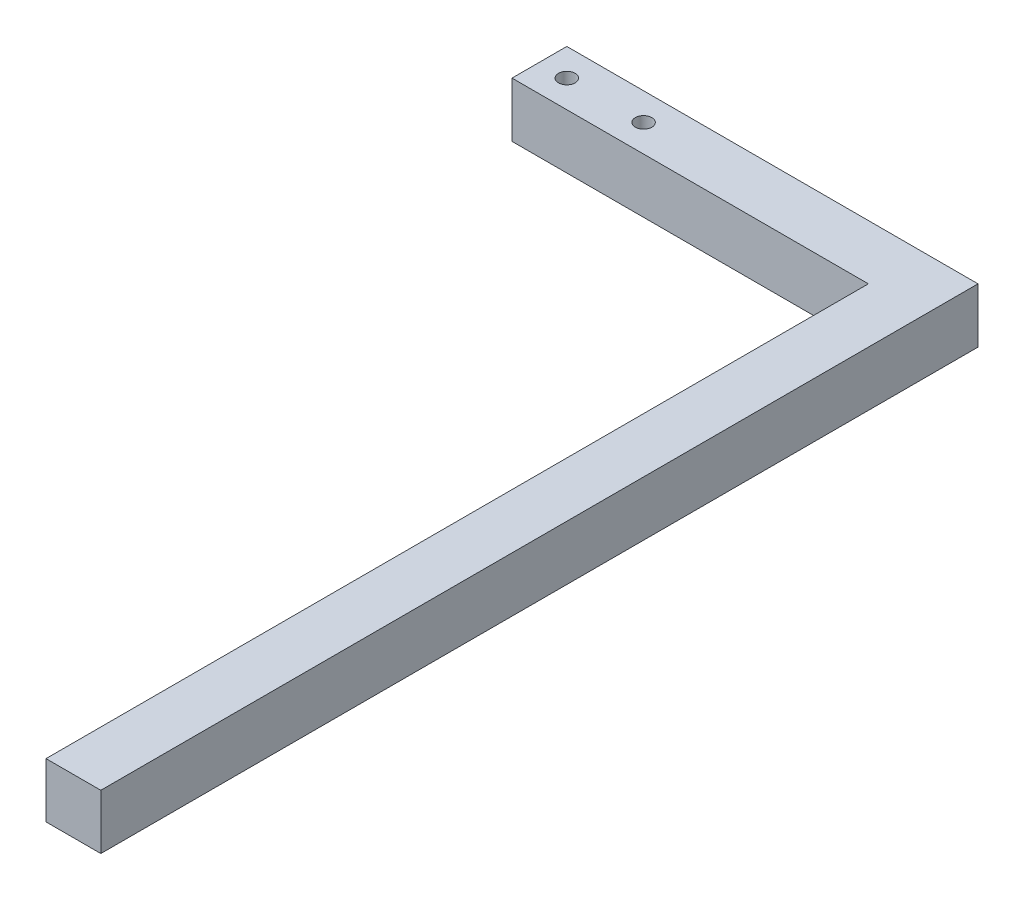
ISO-10303-21;
HEADER;
FILE_DESCRIPTION(('STEP AP214'),'2;1');
FILE_NAME('part.step','',(''),(''),'','','');
FILE_SCHEMA(('AUTOMOTIVE_DESIGN { 1 0 10303 214 1 1 1 1 }'));
ENDSEC;
DATA;
#1=APPLICATION_CONTEXT('core data for automotive mechanical design processes');
#2=APPLICATION_PROTOCOL_DEFINITION('international standard','automotive_design',2000,#1);
#3=PRODUCT_CONTEXT('',#1,'mechanical');
#4=PRODUCT('Part','Part','',(#3));
#5=PRODUCT_RELATED_PRODUCT_CATEGORY('part','',(#4));
#6=PRODUCT_DEFINITION_FORMATION('','',#4);
#7=PRODUCT_DEFINITION_CONTEXT('part definition',#1,'design');
#8=PRODUCT_DEFINITION('design','',#6,#7);
#9=PRODUCT_DEFINITION_SHAPE('','',#8);
#10=(LENGTH_UNIT() NAMED_UNIT(*) SI_UNIT(.MILLI.,.METRE.));
#11=(NAMED_UNIT(*) PLANE_ANGLE_UNIT() SI_UNIT($,.RADIAN.));
#12=(NAMED_UNIT(*) SI_UNIT($,.STERADIAN.) SOLID_ANGLE_UNIT());
#13=UNCERTAINTY_MEASURE_WITH_UNIT(LENGTH_MEASURE(1.E-05),#10,'distance_accuracy_value','');
#14=(GEOMETRIC_REPRESENTATION_CONTEXT(3) GLOBAL_UNCERTAINTY_ASSIGNED_CONTEXT((#13)) GLOBAL_UNIT_ASSIGNED_CONTEXT((#10,
#11,#12)) REPRESENTATION_CONTEXT('',''));
#15=CARTESIAN_POINT('',(0.,0.,0.));
#16=DIRECTION('',(0.,0.,1.));
#17=DIRECTION('',(1.,0.,0.));
#18=AXIS2_PLACEMENT_3D('',#15,#16,#17);
#19=CARTESIAN_POINT('',(0.,10.,0.));
#20=DIRECTION('',(0.,0.,-1.));
#21=DIRECTION('',(-1.,0.,0.));
#22=AXIS2_PLACEMENT_3D('',#19,#20,#21);
#23=PLANE('',#22);
#24=DIRECTION('',(0.,-1.,0.));
#25=VECTOR('',#24,1.);
#26=CARTESIAN_POINT('',(65.,0.,0.));
#27=LINE('',#26,#25);
#28=CARTESIAN_POINT('',(65.,10.,0.));
#29=VERTEX_POINT('',#28);
#30=CARTESIAN_POINT('',(65.,0.,0.));
#31=VERTEX_POINT('',#30);
#32=EDGE_CURVE('E51',#29,#31,#27,.T.);
#33=ORIENTED_EDGE('',*,*,#32,.F.);
#34=DIRECTION('',(1.,0.,0.));
#35=VECTOR('',#34,1.);
#36=CARTESIAN_POINT('',(0.,10.,0.));
#37=LINE('',#36,#35);
#38=CARTESIAN_POINT('',(0.,10.,0.));
#39=VERTEX_POINT('',#38);
#40=EDGE_CURVE('E79',#39,#29,#37,.T.);
#41=ORIENTED_EDGE('',*,*,#40,.F.);
#42=DIRECTION('',(0.,-1.,0.));
#43=VECTOR('',#42,1.);
#44=CARTESIAN_POINT('',(0.,10.,0.));
#45=LINE('',#44,#43);
#46=CARTESIAN_POINT('',(0.,0.,0.));
#47=VERTEX_POINT('',#46);
#48=EDGE_CURVE('E11',#39,#47,#45,.T.);
#49=ORIENTED_EDGE('',*,*,#48,.T.);
#50=DIRECTION('',(1.,0.,0.));
#51=VECTOR('',#50,1.);
#52=CARTESIAN_POINT('',(0.,0.,0.));
#53=LINE('',#52,#51);
#54=EDGE_CURVE('E145',#47,#31,#53,.T.);
#55=ORIENTED_EDGE('',*,*,#54,.T.);
#56=EDGE_LOOP('',(#33,#41,#49,#55));
#57=FACE_BOUND('',#56,.T.);
#58=ADVANCED_FACE('F36',(#57),#23,.F.);
#59=CARTESIAN_POINT('',(0.,10.,0.));
#60=DIRECTION('',(0.,-1.,0.));
#61=DIRECTION('',(0.,0.,-1.));
#62=AXIS2_PLACEMENT_3D('',#59,#60,#61);
#63=PLANE('',#62);
#64=DIRECTION('',(0.,0.,1.));
#65=VECTOR('',#64,1.);
#66=CARTESIAN_POINT('',(0.,10.,0.));
#67=LINE('',#66,#65);
#68=CARTESIAN_POINT('',(0.,10.,-10.));
#69=VERTEX_POINT('',#68);
#70=EDGE_CURVE('E138',#69,#39,#67,.T.);
#71=ORIENTED_EDGE('',*,*,#70,.T.);
#72=ORIENTED_EDGE('',*,*,#40,.T.);
#73=DIRECTION('',(0.,0.,-1.));
#74=VECTOR('',#73,1.);
#75=CARTESIAN_POINT('',(65.,10.,150.));
#76=LINE('',#75,#74);
#77=CARTESIAN_POINT('',(65.,10.,150.));
#78=VERTEX_POINT('',#77);
#79=EDGE_CURVE('E107',#78,#29,#76,.T.);
#80=ORIENTED_EDGE('',*,*,#79,.F.);
#81=DIRECTION('',(-1.,0.,0.));
#82=VECTOR('',#81,1.);
#83=CARTESIAN_POINT('',(75.,10.,150.));
#84=LINE('',#83,#82);
#85=CARTESIAN_POINT('',(75.,10.,150.));
#86=VERTEX_POINT('',#85);
#87=EDGE_CURVE('E103',#86,#78,#84,.T.);
#88=ORIENTED_EDGE('',*,*,#87,.F.);
#89=DIRECTION('',(0.,0.,-1.));
#90=VECTOR('',#89,1.);
#91=CARTESIAN_POINT('',(75.,10.,-10.));
#92=LINE('',#91,#90);
#93=CARTESIAN_POINT('',(75.,10.,-10.));
#94=VERTEX_POINT('',#93);
#95=EDGE_CURVE('E96',#86,#94,#92,.T.);
#96=ORIENTED_EDGE('',*,*,#95,.T.);
#97=DIRECTION('',(-1.,0.,0.));
#98=VECTOR('',#97,1.);
#99=CARTESIAN_POINT('',(0.,10.,-10.));
#100=LINE('',#99,#98);
#101=EDGE_CURVE('E60',#94,#69,#100,.T.);
#102=ORIENTED_EDGE('',*,*,#101,.T.);
#103=EDGE_LOOP('',(#71,#72,#80,#88,#96,#102));
#104=FACE_BOUND('',#103,.T.);
#105=CARTESIAN_POINT('',(5.,10.,-5.));
#106=DIRECTION('',(0.,1.,0.));
#107=DIRECTION('',(0.,0.,1.));
#108=AXIS2_PLACEMENT_3D('',#105,#106,#107);
#109=CIRCLE('',#108,1.51832050823192);
#110=CARTESIAN_POINT('',(5.,10.,-3.48167949176808));
#111=VERTEX_POINT('',#110);
#112=EDGE_CURVE('E132',#111,#111,#109,.T.);
#113=ORIENTED_EDGE('',*,*,#112,.F.);
#114=EDGE_LOOP('',(#113));
#115=FACE_BOUND('',#114,.T.);
#116=CARTESIAN_POINT('',(19.,10.,-5.));
#117=DIRECTION('',(0.,1.,0.));
#118=DIRECTION('',(0.,0.,1.));
#119=AXIS2_PLACEMENT_3D('',#116,#117,#118);
#120=CIRCLE('',#119,1.51832050823193);
#121=CARTESIAN_POINT('',(19.,10.,-3.48167949176807));
#122=VERTEX_POINT('',#121);
#123=EDGE_CURVE('E126',#122,#122,#120,.T.);
#124=ORIENTED_EDGE('',*,*,#123,.F.);
#125=EDGE_LOOP('',(#124));
#126=FACE_BOUND('',#125,.T.);
#127=ADVANCED_FACE('F104',(#104,#115,#126),#63,.F.);
#128=CARTESIAN_POINT('',(0.,0.,0.));
#129=DIRECTION('',(0.,-1.,0.));
#130=DIRECTION('',(0.,0.,-1.));
#131=AXIS2_PLACEMENT_3D('',#128,#129,#130);
#132=PLANE('',#131);
#133=CARTESIAN_POINT('',(5.,0.,-5.));
#134=DIRECTION('',(0.,1.,0.));
#135=DIRECTION('',(0.,0.,1.));
#136=AXIS2_PLACEMENT_3D('',#133,#134,#135);
#137=CIRCLE('',#136,1.51832050823192);
#138=CARTESIAN_POINT('',(5.,0.,-3.48167949176808));
#139=VERTEX_POINT('',#138);
#140=EDGE_CURVE('E129',#139,#139,#137,.T.);
#141=ORIENTED_EDGE('',*,*,#140,.T.);
#142=EDGE_LOOP('',(#141));
#143=FACE_BOUND('',#142,.T.);
#144=DIRECTION('',(0.,0.,1.));
#145=VECTOR('',#144,1.);
#146=CARTESIAN_POINT('',(0.,0.,0.));
#147=LINE('',#146,#145);
#148=CARTESIAN_POINT('',(0.,0.,-10.));
#149=VERTEX_POINT('',#148);
#150=EDGE_CURVE('E135',#149,#47,#147,.T.);
#151=ORIENTED_EDGE('',*,*,#150,.F.);
#152=DIRECTION('',(-1.,0.,0.));
#153=VECTOR('',#152,1.);
#154=CARTESIAN_POINT('',(0.,0.,-10.));
#155=LINE('',#154,#153);
#156=CARTESIAN_POINT('',(75.,0.,-10.));
#157=VERTEX_POINT('',#156);
#158=EDGE_CURVE('E77',#157,#149,#155,.T.);
#159=ORIENTED_EDGE('',*,*,#158,.F.);
#160=DIRECTION('',(0.,0.,-1.));
#161=VECTOR('',#160,1.);
#162=CARTESIAN_POINT('',(75.,0.,-10.));
#163=LINE('',#162,#161);
#164=CARTESIAN_POINT('',(75.,0.,150.));
#165=VERTEX_POINT('',#164);
#166=EDGE_CURVE('E147',#165,#157,#163,.T.);
#167=ORIENTED_EDGE('',*,*,#166,.F.);
#168=DIRECTION('',(1.,0.,0.));
#169=VECTOR('',#168,1.);
#170=CARTESIAN_POINT('',(75.,0.,150.));
#171=LINE('',#170,#169);
#172=CARTESIAN_POINT('',(65.,0.,150.));
#173=VERTEX_POINT('',#172);
#174=EDGE_CURVE('E115',#173,#165,#171,.T.);
#175=ORIENTED_EDGE('',*,*,#174,.F.);
#176=DIRECTION('',(0.,0.,-1.));
#177=VECTOR('',#176,1.);
#178=CARTESIAN_POINT('',(65.,0.,150.));
#179=LINE('',#178,#177);
#180=EDGE_CURVE('E120',#173,#31,#179,.T.);
#181=ORIENTED_EDGE('',*,*,#180,.T.);
#182=ORIENTED_EDGE('',*,*,#54,.F.);
#183=EDGE_LOOP('',(#151,#159,#167,#175,#181,#182));
#184=FACE_BOUND('',#183,.T.);
#185=CARTESIAN_POINT('',(19.,0.,-5.));
#186=DIRECTION('',(0.,1.,0.));
#187=DIRECTION('',(0.,0.,1.));
#188=AXIS2_PLACEMENT_3D('',#185,#186,#187);
#189=CIRCLE('',#188,1.51832050823193);
#190=CARTESIAN_POINT('',(19.,0.,-3.48167949176807));
#191=VERTEX_POINT('',#190);
#192=EDGE_CURVE('E125',#191,#191,#189,.T.);
#193=ORIENTED_EDGE('',*,*,#192,.T.);
#194=EDGE_LOOP('',(#193));
#195=FACE_BOUND('',#194,.T.);
#196=ADVANCED_FACE('F153',(#143,#184,#195),#132,.T.);
#197=CARTESIAN_POINT('',(0.,10.,0.));
#198=DIRECTION('',(1.,0.,0.));
#199=DIRECTION('',(0.,0.,-1.));
#200=AXIS2_PLACEMENT_3D('',#197,#198,#199);
#201=PLANE('',#200);
#202=ORIENTED_EDGE('',*,*,#150,.T.);
#203=ORIENTED_EDGE('',*,*,#48,.F.);
#204=ORIENTED_EDGE('',*,*,#70,.F.);
#205=DIRECTION('',(0.,-1.,0.));
#206=VECTOR('',#205,1.);
#207=CARTESIAN_POINT('',(0.,10.,-10.));
#208=LINE('',#207,#206);
#209=EDGE_CURVE('E142',#69,#149,#208,.T.);
#210=ORIENTED_EDGE('',*,*,#209,.T.);
#211=EDGE_LOOP('',(#202,#203,#204,#210));
#212=FACE_BOUND('',#211,.T.);
#213=ADVANCED_FACE('F38',(#212),#201,.F.);
#214=CARTESIAN_POINT('',(75.,10.,-10.));
#215=DIRECTION('',(-1.,0.,0.));
#216=DIRECTION('',(0.,0.,1.));
#217=AXIS2_PLACEMENT_3D('',#214,#215,#216);
#218=PLANE('',#217);
#219=ORIENTED_EDGE('',*,*,#166,.T.);
#220=DIRECTION('',(0.,-1.,0.));
#221=VECTOR('',#220,1.);
#222=CARTESIAN_POINT('',(75.,10.,-10.));
#223=LINE('',#222,#221);
#224=EDGE_CURVE('E44',#94,#157,#223,.T.);
#225=ORIENTED_EDGE('',*,*,#224,.F.);
#226=ORIENTED_EDGE('',*,*,#95,.F.);
#227=DIRECTION('',(0.,1.,0.));
#228=VECTOR('',#227,1.);
#229=CARTESIAN_POINT('',(75.,0.,150.));
#230=LINE('',#229,#228);
#231=EDGE_CURVE('E100',#165,#86,#230,.T.);
#232=ORIENTED_EDGE('',*,*,#231,.F.);
#233=EDGE_LOOP('',(#219,#225,#226,#232));
#234=FACE_BOUND('',#233,.T.);
#235=ADVANCED_FACE('F98',(#234),#218,.F.);
#236=CARTESIAN_POINT('',(0.,10.,-10.));
#237=DIRECTION('',(0.,0.,1.));
#238=DIRECTION('',(1.,0.,0.));
#239=AXIS2_PLACEMENT_3D('',#236,#237,#238);
#240=PLANE('',#239);
#241=ORIENTED_EDGE('',*,*,#158,.T.);
#242=ORIENTED_EDGE('',*,*,#209,.F.);
#243=ORIENTED_EDGE('',*,*,#101,.F.);
#244=ORIENTED_EDGE('',*,*,#224,.T.);
#245=EDGE_LOOP('',(#241,#242,#243,#244));
#246=FACE_BOUND('',#245,.T.);
#247=ADVANCED_FACE('F150',(#246),#240,.F.);
#248=CARTESIAN_POINT('',(5.,10.,-5.));
#249=DIRECTION('',(0.,-1.,0.));
#250=DIRECTION('',(0.,0.,-1.));
#251=AXIS2_PLACEMENT_3D('',#248,#249,#250);
#252=CYLINDRICAL_SURFACE('',#251,1.51832050823192);
#253=ORIENTED_EDGE('',*,*,#112,.T.);
#254=EDGE_LOOP('',(#253));
#255=FACE_BOUND('',#254,.T.);
#256=ORIENTED_EDGE('',*,*,#140,.F.);
#257=EDGE_LOOP('',(#256));
#258=FACE_BOUND('',#257,.T.);
#259=ADVANCED_FACE('F169',(#255,#258),#252,.F.);
#260=CARTESIAN_POINT('',(19.,10.,-5.));
#261=DIRECTION('',(0.,-1.,0.));
#262=DIRECTION('',(0.,0.,-1.));
#263=AXIS2_PLACEMENT_3D('',#260,#261,#262);
#264=CYLINDRICAL_SURFACE('',#263,1.51832050823193);
#265=ORIENTED_EDGE('',*,*,#123,.T.);
#266=EDGE_LOOP('',(#265));
#267=FACE_BOUND('',#266,.T.);
#268=ORIENTED_EDGE('',*,*,#192,.F.);
#269=EDGE_LOOP('',(#268));
#270=FACE_BOUND('',#269,.T.);
#271=ADVANCED_FACE('F162',(#267,#270),#264,.F.);
#272=CARTESIAN_POINT('',(65.,0.,150.));
#273=DIRECTION('',(1.,0.,0.));
#274=DIRECTION('',(0.,0.,-1.));
#275=AXIS2_PLACEMENT_3D('',#272,#273,#274);
#276=PLANE('',#275);
#277=ORIENTED_EDGE('',*,*,#32,.T.);
#278=ORIENTED_EDGE('',*,*,#180,.F.);
#279=DIRECTION('',(0.,-1.,0.));
#280=VECTOR('',#279,1.);
#281=CARTESIAN_POINT('',(65.,0.,150.));
#282=LINE('',#281,#280);
#283=EDGE_CURVE('E110',#78,#173,#282,.T.);
#284=ORIENTED_EDGE('',*,*,#283,.F.);
#285=ORIENTED_EDGE('',*,*,#79,.T.);
#286=EDGE_LOOP('',(#277,#278,#284,#285));
#287=FACE_BOUND('',#286,.T.);
#288=ADVANCED_FACE('F159',(#287),#276,.F.);
#289=CARTESIAN_POINT('',(0.,0.,150.));
#290=DIRECTION('',(0.,0.,1.));
#291=DIRECTION('',(1.,0.,0.));
#292=AXIS2_PLACEMENT_3D('',#289,#290,#291);
#293=PLANE('',#292);
#294=ORIENTED_EDGE('',*,*,#231,.T.);
#295=ORIENTED_EDGE('',*,*,#87,.T.);
#296=ORIENTED_EDGE('',*,*,#283,.T.);
#297=ORIENTED_EDGE('',*,*,#174,.T.);
#298=EDGE_LOOP('',(#294,#295,#296,#297));
#299=FACE_BOUND('',#298,.T.);
#300=ADVANCED_FACE('F113',(#299),#293,.T.);
#301=CLOSED_SHELL('',(#58,#127,#196,#213,#235,#247,#259,#271,#288,#300));
#302=MANIFOLD_SOLID_BREP('B2',#301);
#303=ADVANCED_BREP_SHAPE_REPRESENTATION('',(#18,#302),#14);
#304=SHAPE_DEFINITION_REPRESENTATION(#9,#303);
ENDSEC;
END-ISO-10303-21;
